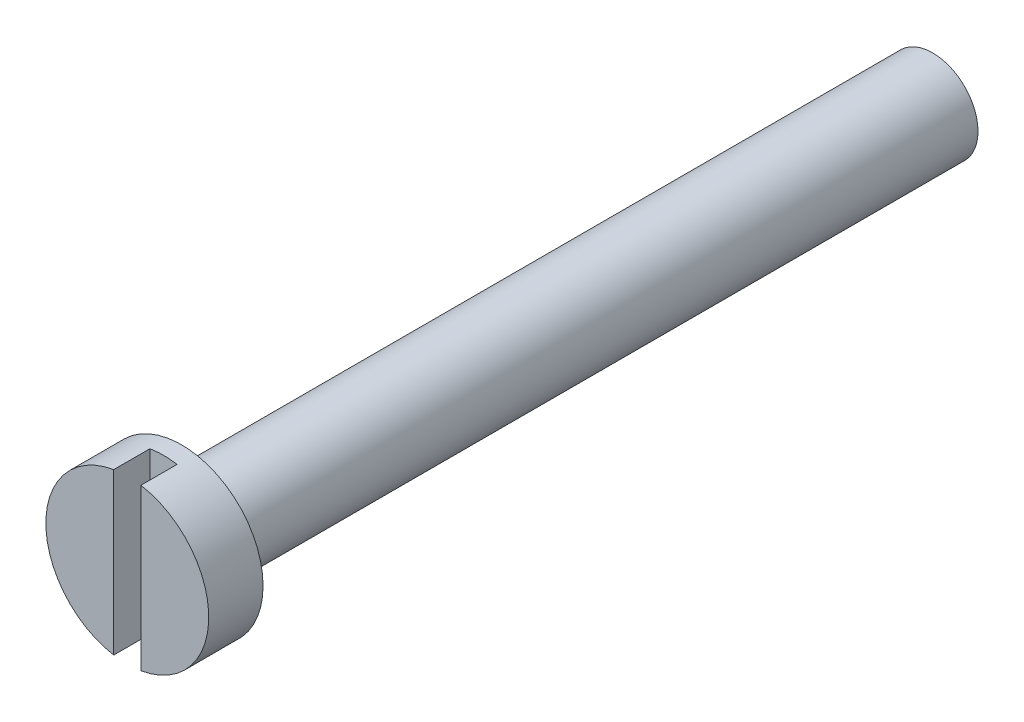
ISO-10303-21;
HEADER;
FILE_DESCRIPTION(('STEP AP214'),'2;1');
FILE_NAME('part.step','',(''),(''),'','','');
FILE_SCHEMA(('AUTOMOTIVE_DESIGN { 1 0 10303 214 1 1 1 1 }'));
ENDSEC;
DATA;
#1=APPLICATION_CONTEXT('core data for automotive mechanical design processes');
#2=APPLICATION_PROTOCOL_DEFINITION('international standard','automotive_design',2000,#1);
#3=PRODUCT_CONTEXT('',#1,'mechanical');
#4=PRODUCT('Part','Part','',(#3));
#5=PRODUCT_RELATED_PRODUCT_CATEGORY('part','',(#4));
#6=PRODUCT_DEFINITION_FORMATION('','',#4);
#7=PRODUCT_DEFINITION_CONTEXT('part definition',#1,'design');
#8=PRODUCT_DEFINITION('design','',#6,#7);
#9=PRODUCT_DEFINITION_SHAPE('','',#8);
#10=(LENGTH_UNIT() NAMED_UNIT(*) SI_UNIT(.MILLI.,.METRE.));
#11=(NAMED_UNIT(*) PLANE_ANGLE_UNIT() SI_UNIT($,.RADIAN.));
#12=(NAMED_UNIT(*) SI_UNIT($,.STERADIAN.) SOLID_ANGLE_UNIT());
#13=UNCERTAINTY_MEASURE_WITH_UNIT(LENGTH_MEASURE(1.E-05),#10,'distance_accuracy_value','');
#14=(GEOMETRIC_REPRESENTATION_CONTEXT(3) GLOBAL_UNCERTAINTY_ASSIGNED_CONTEXT((#13)) GLOBAL_UNIT_ASSIGNED_CONTEXT((#10,
#11,#12)) REPRESENTATION_CONTEXT('',''));
#15=CARTESIAN_POINT('',(0.,0.,0.));
#16=DIRECTION('',(0.,0.,1.));
#17=DIRECTION('',(1.,0.,0.));
#18=AXIS2_PLACEMENT_3D('',#15,#16,#17);
#19=CARTESIAN_POINT('',(0.,0.,44.5));
#20=DIRECTION('',(0.,0.,1.));
#21=DIRECTION('',(1.,0.,0.));
#22=AXIS2_PLACEMENT_3D('',#19,#20,#21);
#23=PLANE('',#22);
#24=DIRECTION('',(0.,1.,0.));
#25=VECTOR('',#24,1.);
#26=CARTESIAN_POINT('',(0.75,0.,44.5));
#27=LINE('',#26,#25);
#28=CARTESIAN_POINT('',(0.750000000000001,-4.43705983732471,44.5));
#29=VERTEX_POINT('',#28);
#30=CARTESIAN_POINT('',(0.75,4.43705983732471,44.5));
#31=VERTEX_POINT('',#30);
#32=EDGE_CURVE('E124',#29,#31,#27,.T.);
#33=ORIENTED_EDGE('',*,*,#32,.F.);
#34=CARTESIAN_POINT('',(0.,0.,44.5));
#35=DIRECTION('',(0.,0.,1.));
#36=DIRECTION('',(1.,0.,0.));
#37=AXIS2_PLACEMENT_3D('',#34,#35,#36);
#38=CIRCLE('',#37,4.5);
#39=EDGE_CURVE('E111',#29,#31,#38,.T.);
#40=ORIENTED_EDGE('',*,*,#39,.T.);
#41=EDGE_LOOP('',(#33,#40));
#42=FACE_BOUND('',#41,.T.);
#43=ADVANCED_FACE('F39',(#42),#23,.T.);
#44=CARTESIAN_POINT('',(0.,0.,41.5));
#45=DIRECTION('',(0.,0.,-1.));
#46=DIRECTION('',(-1.,0.,0.));
#47=AXIS2_PLACEMENT_3D('',#44,#45,#46);
#48=CYLINDRICAL_SURFACE('',#47,2.5);
#49=CARTESIAN_POINT('',(0.,0.,41.5));
#50=DIRECTION('',(0.,0.,1.));
#51=DIRECTION('',(1.,0.,0.));
#52=AXIS2_PLACEMENT_3D('',#49,#50,#51);
#53=CIRCLE('',#52,2.5);
#54=CARTESIAN_POINT('',(2.5,0.,41.5));
#55=VERTEX_POINT('',#54);
#56=EDGE_CURVE('E117',#55,#55,#53,.T.);
#57=ORIENTED_EDGE('',*,*,#56,.F.);
#58=EDGE_LOOP('',(#57));
#59=FACE_BOUND('',#58,.T.);
#60=CARTESIAN_POINT('',(0.,0.,0.));
#61=DIRECTION('',(0.,0.,1.));
#62=DIRECTION('',(1.,0.,0.));
#63=AXIS2_PLACEMENT_3D('',#60,#61,#62);
#64=CIRCLE('',#63,2.5);
#65=CARTESIAN_POINT('',(2.5,0.,0.));
#66=VERTEX_POINT('',#65);
#67=EDGE_CURVE('E121',#66,#66,#64,.T.);
#68=ORIENTED_EDGE('',*,*,#67,.T.);
#69=EDGE_LOOP('',(#68));
#70=FACE_BOUND('',#69,.T.);
#71=ADVANCED_FACE('F41',(#59,#70),#48,.T.);
#72=CARTESIAN_POINT('',(0.,0.,0.));
#73=DIRECTION('',(0.,0.,1.));
#74=DIRECTION('',(1.,0.,0.));
#75=AXIS2_PLACEMENT_3D('',#72,#73,#74);
#76=PLANE('',#75);
#77=CARTESIAN_POINT('',(0.,0.,0.));
#78=DIRECTION('',(0.,0.,-1.));
#79=DIRECTION('',(-1.,0.,0.));
#80=AXIS2_PLACEMENT_3D('',#77,#78,#79);
#81=CIRCLE('',#80,1.25);
#82=CARTESIAN_POINT('',(-1.25,0.,0.));
#83=VERTEX_POINT('',#82);
#84=EDGE_CURVE('E93',#83,#83,#81,.T.);
#85=ORIENTED_EDGE('',*,*,#84,.F.);
#86=EDGE_LOOP('',(#85));
#87=FACE_BOUND('',#86,.T.);
#88=ORIENTED_EDGE('',*,*,#67,.F.);
#89=EDGE_LOOP('',(#88));
#90=FACE_BOUND('',#89,.T.);
#91=ADVANCED_FACE('F142',(#87,#90),#76,.F.);
#92=CARTESIAN_POINT('',(0.,0.,44.5));
#93=DIRECTION('',(0.,0.,-1.));
#94=DIRECTION('',(-1.,0.,0.));
#95=AXIS2_PLACEMENT_3D('',#92,#93,#94);
#96=CYLINDRICAL_SURFACE('',#95,4.5);
#97=CARTESIAN_POINT('',(0.,0.,42.5));
#98=DIRECTION('',(0.,0.,1.));
#99=DIRECTION('',(1.,0.,0.));
#100=AXIS2_PLACEMENT_3D('',#97,#98,#99);
#101=CIRCLE('',#100,4.5);
#102=CARTESIAN_POINT('',(0.75,4.43705983732471,42.5));
#103=VERTEX_POINT('',#102);
#104=CARTESIAN_POINT('',(-0.75,4.43705983732471,42.5));
#105=VERTEX_POINT('',#104);
#106=EDGE_CURVE('E11',#103,#105,#101,.T.);
#107=ORIENTED_EDGE('',*,*,#106,.F.);
#108=DIRECTION('',(0.,0.,-1.));
#109=VECTOR('',#108,1.);
#110=CARTESIAN_POINT('',(0.75,4.43705983732471,44.5));
#111=LINE('',#110,#109);
#112=EDGE_CURVE('E62',#103,#31,#111,.F.);
#113=ORIENTED_EDGE('',*,*,#112,.T.);
#114=ORIENTED_EDGE('',*,*,#39,.F.);
#115=DIRECTION('',(0.,0.,-1.));
#116=VECTOR('',#115,1.);
#117=CARTESIAN_POINT('',(0.750000000000001,-4.43705983732471,44.5));
#118=LINE('',#117,#116);
#119=CARTESIAN_POINT('',(0.750000000000001,-4.43705983732471,42.5));
#120=VERTEX_POINT('',#119);
#121=EDGE_CURVE('E107',#29,#120,#118,.T.);
#122=ORIENTED_EDGE('',*,*,#121,.T.);
#123=CARTESIAN_POINT('',(-0.749999999999999,-4.43705983732471,42.5));
#124=VERTEX_POINT('',#123);
#125=EDGE_CURVE('E43',#124,#120,#101,.T.);
#126=ORIENTED_EDGE('',*,*,#125,.F.);
#127=DIRECTION('',(0.,0.,-1.));
#128=VECTOR('',#127,1.);
#129=CARTESIAN_POINT('',(-0.749999999999999,-4.43705983732471,44.5));
#130=LINE('',#129,#128);
#131=CARTESIAN_POINT('',(-0.749999999999999,-4.43705983732471,44.5));
#132=VERTEX_POINT('',#131);
#133=EDGE_CURVE('E102',#124,#132,#130,.F.);
#134=ORIENTED_EDGE('',*,*,#133,.T.);
#135=CARTESIAN_POINT('',(-0.75,4.43705983732471,44.5));
#136=VERTEX_POINT('',#135);
#137=EDGE_CURVE('E114',#136,#132,#38,.T.);
#138=ORIENTED_EDGE('',*,*,#137,.F.);
#139=DIRECTION('',(0.,0.,-1.));
#140=VECTOR('',#139,1.);
#141=CARTESIAN_POINT('',(-0.75,4.43705983732471,44.5));
#142=LINE('',#141,#140);
#143=EDGE_CURVE('E54',#136,#105,#142,.T.);
#144=ORIENTED_EDGE('',*,*,#143,.T.);
#145=EDGE_LOOP('',(#107,#113,#114,#122,#126,#134,#138,#144));
#146=FACE_BOUND('',#145,.T.);
#147=CARTESIAN_POINT('',(0.,0.,41.5));
#148=DIRECTION('',(0.,0.,1.));
#149=DIRECTION('',(1.,0.,0.));
#150=AXIS2_PLACEMENT_3D('',#147,#148,#149);
#151=CIRCLE('',#150,4.5);
#152=CARTESIAN_POINT('',(4.5,0.,41.5));
#153=VERTEX_POINT('',#152);
#154=EDGE_CURVE('E110',#153,#153,#151,.T.);
#155=ORIENTED_EDGE('',*,*,#154,.T.);
#156=EDGE_LOOP('',(#155));
#157=FACE_BOUND('',#156,.T.);
#158=ADVANCED_FACE('F133',(#146,#157),#96,.T.);
#159=DIRECTION('',(0.,-1.,0.));
#160=VECTOR('',#159,1.);
#161=CARTESIAN_POINT('',(-0.75,0.,44.5));
#162=LINE('',#161,#160);
#163=EDGE_CURVE('E120',#136,#132,#162,.T.);
#164=ORIENTED_EDGE('',*,*,#163,.F.);
#165=ORIENTED_EDGE('',*,*,#137,.T.);
#166=EDGE_LOOP('',(#164,#165));
#167=FACE_BOUND('',#166,.T.);
#168=ADVANCED_FACE('F138',(#167),#23,.T.);
#169=CARTESIAN_POINT('',(0.,0.,41.5));
#170=DIRECTION('',(0.,0.,1.));
#171=DIRECTION('',(1.,0.,0.));
#172=AXIS2_PLACEMENT_3D('',#169,#170,#171);
#173=PLANE('',#172);
#174=ORIENTED_EDGE('',*,*,#56,.T.);
#175=EDGE_LOOP('',(#174));
#176=FACE_BOUND('',#175,.T.);
#177=ORIENTED_EDGE('',*,*,#154,.F.);
#178=EDGE_LOOP('',(#177));
#179=FACE_BOUND('',#178,.T.);
#180=ADVANCED_FACE('F147',(#176,#179),#173,.F.);
#181=CARTESIAN_POINT('',(0.,0.,42.5));
#182=DIRECTION('',(0.,0.,1.));
#183=DIRECTION('',(1.,0.,0.));
#184=AXIS2_PLACEMENT_3D('',#181,#182,#183);
#185=PLANE('',#184);
#186=ORIENTED_EDGE('',*,*,#106,.T.);
#187=DIRECTION('',(0.,-1.,0.));
#188=VECTOR('',#187,1.);
#189=CARTESIAN_POINT('',(-0.75,5.46844597131234,42.5));
#190=LINE('',#189,#188);
#191=EDGE_CURVE('E95',#105,#124,#190,.T.);
#192=ORIENTED_EDGE('',*,*,#191,.T.);
#193=ORIENTED_EDGE('',*,*,#125,.T.);
#194=DIRECTION('',(0.,1.,0.));
#195=VECTOR('',#194,1.);
#196=CARTESIAN_POINT('',(0.75,5.46844597131234,42.5));
#197=LINE('',#196,#195);
#198=EDGE_CURVE('E92',#120,#103,#197,.T.);
#199=ORIENTED_EDGE('',*,*,#198,.T.);
#200=EDGE_LOOP('',(#186,#192,#193,#199));
#201=FACE_BOUND('',#200,.T.);
#202=ADVANCED_FACE('F128',(#201),#185,.T.);
#203=CARTESIAN_POINT('',(0.75,5.46844597131234,42.5));
#204=DIRECTION('',(1.,0.,0.));
#205=DIRECTION('',(0.,1.,0.));
#206=AXIS2_PLACEMENT_3D('',#203,#204,#205);
#207=PLANE('',#206);
#208=ORIENTED_EDGE('',*,*,#32,.T.);
#209=ORIENTED_EDGE('',*,*,#112,.F.);
#210=ORIENTED_EDGE('',*,*,#198,.F.);
#211=ORIENTED_EDGE('',*,*,#121,.F.);
#212=EDGE_LOOP('',(#208,#209,#210,#211));
#213=FACE_BOUND('',#212,.T.);
#214=ADVANCED_FACE('F131',(#213),#207,.F.);
#215=CARTESIAN_POINT('',(-0.75,5.46844597131234,42.5));
#216=DIRECTION('',(-1.,0.,0.));
#217=DIRECTION('',(0.,-1.,0.));
#218=AXIS2_PLACEMENT_3D('',#215,#216,#217);
#219=PLANE('',#218);
#220=ORIENTED_EDGE('',*,*,#163,.T.);
#221=ORIENTED_EDGE('',*,*,#133,.F.);
#222=ORIENTED_EDGE('',*,*,#191,.F.);
#223=ORIENTED_EDGE('',*,*,#143,.F.);
#224=EDGE_LOOP('',(#220,#221,#222,#223));
#225=FACE_BOUND('',#224,.T.);
#226=ADVANCED_FACE('F86',(#225),#219,.F.);
#227=CARTESIAN_POINT('',(0.,0.,10.));
#228=DIRECTION('',(0.,0.,-1.));
#229=DIRECTION('',(-1.,0.,0.));
#230=AXIS2_PLACEMENT_3D('',#227,#228,#229);
#231=CONICAL_SURFACE('',#230,1.25,1.02974425867665);
#232=CARTESIAN_POINT('',(0.,0.,10.7510757737845));
#233=VERTEX_POINT('',#232);
#234=VERTEX_LOOP('',#233);
#235=FACE_BOUND('',#234,.T.);
#236=CARTESIAN_POINT('',(0.,0.,10.));
#237=DIRECTION('',(0.,0.,-1.));
#238=DIRECTION('',(-1.,0.,0.));
#239=AXIS2_PLACEMENT_3D('',#236,#237,#238);
#240=CIRCLE('',#239,1.25);
#241=CARTESIAN_POINT('',(-1.25,0.,10.));
#242=VERTEX_POINT('',#241);
#243=EDGE_CURVE('E90',#242,#242,#240,.T.);
#244=ORIENTED_EDGE('',*,*,#243,.T.);
#245=EDGE_LOOP('',(#244));
#246=FACE_BOUND('',#245,.T.);
#247=ADVANCED_FACE('F82',(#235,#246),#231,.F.);
#248=CARTESIAN_POINT('',(0.,0.,0.));
#249=DIRECTION('',(0.,0.,-1.));
#250=DIRECTION('',(-1.,0.,0.));
#251=AXIS2_PLACEMENT_3D('',#248,#249,#250);
#252=CYLINDRICAL_SURFACE('',#251,1.25);
#253=ORIENTED_EDGE('',*,*,#243,.F.);
#254=EDGE_LOOP('',(#253));
#255=FACE_BOUND('',#254,.T.);
#256=ORIENTED_EDGE('',*,*,#84,.T.);
#257=EDGE_LOOP('',(#256));
#258=FACE_BOUND('',#257,.T.);
#259=ADVANCED_FACE('F85',(#255,#258),#252,.F.);
#260=CLOSED_SHELL('',(#43,#71,#91,#158,#168,#180,#202,#214,#226,#247,#259));
#261=MANIFOLD_SOLID_BREP('B2',#260);
#262=ADVANCED_BREP_SHAPE_REPRESENTATION('',(#18,#261),#14);
#263=SHAPE_DEFINITION_REPRESENTATION(#9,#262);
ENDSEC;
END-ISO-10303-21;
